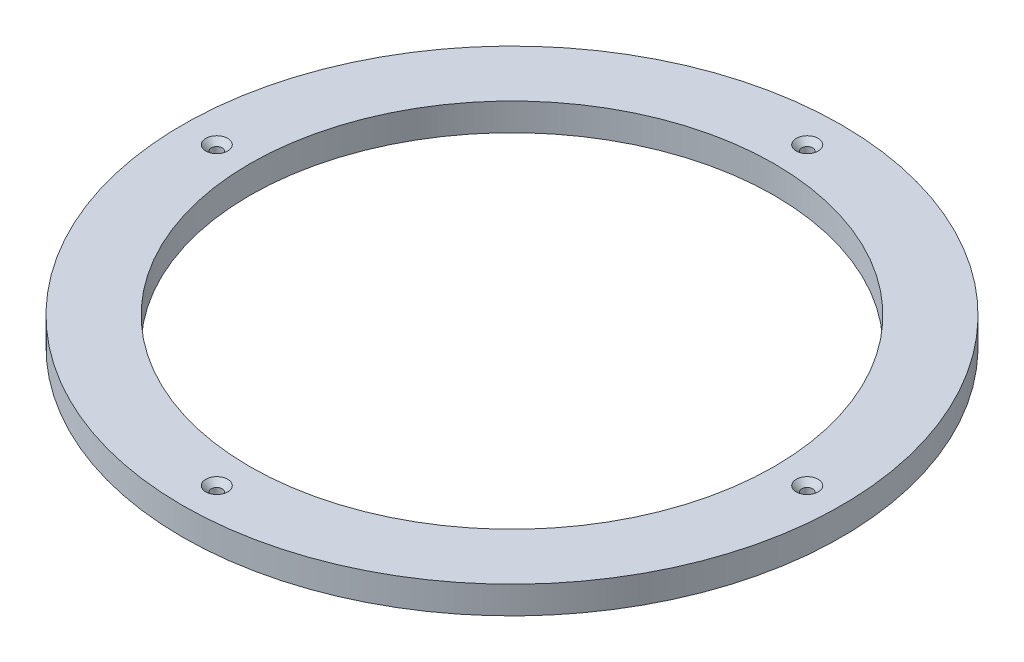
ISO-10303-21;
HEADER;
FILE_DESCRIPTION(('STEP AP214'),'2;1');
FILE_NAME('part.step','',(''),(''),'','','');
FILE_SCHEMA(('AUTOMOTIVE_DESIGN { 1 0 10303 214 1 1 1 1 }'));
ENDSEC;
DATA;
#1=APPLICATION_CONTEXT('core data for automotive mechanical design processes');
#2=APPLICATION_PROTOCOL_DEFINITION('international standard','automotive_design',2000,#1);
#3=PRODUCT_CONTEXT('',#1,'mechanical');
#4=PRODUCT('Part','Part','',(#3));
#5=PRODUCT_RELATED_PRODUCT_CATEGORY('part','',(#4));
#6=PRODUCT_DEFINITION_FORMATION('','',#4);
#7=PRODUCT_DEFINITION_CONTEXT('part definition',#1,'design');
#8=PRODUCT_DEFINITION('design','',#6,#7);
#9=PRODUCT_DEFINITION_SHAPE('','',#8);
#10=(LENGTH_UNIT() NAMED_UNIT(*) SI_UNIT(.MILLI.,.METRE.));
#11=(NAMED_UNIT(*) PLANE_ANGLE_UNIT() SI_UNIT($,.RADIAN.));
#12=(NAMED_UNIT(*) SI_UNIT($,.STERADIAN.) SOLID_ANGLE_UNIT());
#13=UNCERTAINTY_MEASURE_WITH_UNIT(LENGTH_MEASURE(1.E-05),#10,'distance_accuracy_value','');
#14=(GEOMETRIC_REPRESENTATION_CONTEXT(3) GLOBAL_UNCERTAINTY_ASSIGNED_CONTEXT((#13)) GLOBAL_UNIT_ASSIGNED_CONTEXT((#10,
#11,#12)) REPRESENTATION_CONTEXT('',''));
#15=CARTESIAN_POINT('',(0.,0.,0.));
#16=DIRECTION('',(0.,0.,1.));
#17=DIRECTION('',(1.,0.,0.));
#18=AXIS2_PLACEMENT_3D('',#15,#16,#17);
#19=CARTESIAN_POINT('',(0.,5.,0.));
#20=DIRECTION('',(0.,-1.,0.));
#21=DIRECTION('',(0.,0.,-1.));
#22=AXIS2_PLACEMENT_3D('',#19,#20,#21);
#23=CYLINDRICAL_SURFACE('',#22,60.);
#24=CARTESIAN_POINT('',(0.,5.,0.));
#25=DIRECTION('',(0.,1.,0.));
#26=DIRECTION('',(0.,0.,1.));
#27=AXIS2_PLACEMENT_3D('',#24,#25,#26);
#28=CIRCLE('',#27,60.);
#29=CARTESIAN_POINT('',(0.,5.,60.));
#30=VERTEX_POINT('',#29);
#31=EDGE_CURVE('E79',#30,#30,#28,.T.);
#32=ORIENTED_EDGE('',*,*,#31,.F.);
#33=EDGE_LOOP('',(#32));
#34=FACE_BOUND('',#33,.T.);
#35=CARTESIAN_POINT('',(0.,0.,0.));
#36=DIRECTION('',(0.,1.,0.));
#37=DIRECTION('',(0.,0.,1.));
#38=AXIS2_PLACEMENT_3D('',#35,#36,#37);
#39=CIRCLE('',#38,60.);
#40=CARTESIAN_POINT('',(0.,0.,60.));
#41=VERTEX_POINT('',#40);
#42=EDGE_CURVE('E80',#41,#41,#39,.T.);
#43=ORIENTED_EDGE('',*,*,#42,.T.);
#44=EDGE_LOOP('',(#43));
#45=FACE_BOUND('',#44,.T.);
#46=ADVANCED_FACE('F38',(#34,#45),#23,.T.);
#47=CARTESIAN_POINT('',(0.,5.,0.));
#48=DIRECTION('',(0.,1.,0.));
#49=DIRECTION('',(0.,0.,1.));
#50=AXIS2_PLACEMENT_3D('',#47,#48,#49);
#51=PLANE('',#50);
#52=CARTESIAN_POINT('',(0.,5.,0.));
#53=DIRECTION('',(0.,1.,0.));
#54=DIRECTION('',(0.,0.,1.));
#55=AXIS2_PLACEMENT_3D('',#52,#53,#54);
#56=CIRCLE('',#55,47.75);
#57=CARTESIAN_POINT('',(0.,5.,47.75));
#58=VERTEX_POINT('',#57);
#59=EDGE_CURVE('E107',#58,#58,#56,.T.);
#60=ORIENTED_EDGE('',*,*,#59,.F.);
#61=EDGE_LOOP('',(#60));
#62=FACE_BOUND('',#61,.T.);
#63=CARTESIAN_POINT('',(53.75,5.,-5.63001365888455E-13));
#64=DIRECTION('',(0.,1.,0.));
#65=DIRECTION('',(0.,0.,1.));
#66=AXIS2_PLACEMENT_3D('',#63,#64,#65);
#67=CIRCLE('',#66,2.00000000000004);
#68=CARTESIAN_POINT('',(53.75,5.,1.99999999999948));
#69=VERTEX_POINT('',#68);
#70=EDGE_CURVE('E10',#69,#69,#67,.F.);
#71=ORIENTED_EDGE('',*,*,#70,.T.);
#72=EDGE_LOOP('',(#71));
#73=FACE_BOUND('',#72,.T.);
#74=CARTESIAN_POINT('',(0.,5.,53.75));
#75=DIRECTION('',(0.,1.,0.));
#76=DIRECTION('',(0.,0.,1.));
#77=AXIS2_PLACEMENT_3D('',#74,#75,#76);
#78=CIRCLE('',#77,2.00000000000004);
#79=CARTESIAN_POINT('',(0.,5.,55.75));
#80=VERTEX_POINT('',#79);
#81=EDGE_CURVE('E52',#80,#80,#78,.F.);
#82=ORIENTED_EDGE('',*,*,#81,.T.);
#83=EDGE_LOOP('',(#82));
#84=FACE_BOUND('',#83,.T.);
#85=CARTESIAN_POINT('',(-53.75,5.,1.87667121962818E-13));
#86=DIRECTION('',(0.,1.,0.));
#87=DIRECTION('',(0.,0.,1.));
#88=AXIS2_PLACEMENT_3D('',#85,#86,#87);
#89=CIRCLE('',#88,2.00000000000004);
#90=CARTESIAN_POINT('',(-53.75,5.,2.00000000000023));
#91=VERTEX_POINT('',#90);
#92=EDGE_CURVE('E63',#91,#91,#89,.F.);
#93=ORIENTED_EDGE('',*,*,#92,.T.);
#94=EDGE_LOOP('',(#93));
#95=FACE_BOUND('',#94,.T.);
#96=CARTESIAN_POINT('',(0.,5.,-53.75));
#97=DIRECTION('',(0.,1.,0.));
#98=DIRECTION('',(0.,0.,1.));
#99=AXIS2_PLACEMENT_3D('',#96,#97,#98);
#100=CIRCLE('',#99,2.00000000000004);
#101=CARTESIAN_POINT('',(0.,5.,-51.75));
#102=VERTEX_POINT('',#101);
#103=EDGE_CURVE('E71',#102,#102,#100,.F.);
#104=ORIENTED_EDGE('',*,*,#103,.T.);
#105=EDGE_LOOP('',(#104));
#106=FACE_BOUND('',#105,.T.);
#107=ORIENTED_EDGE('',*,*,#31,.T.);
#108=EDGE_LOOP('',(#107));
#109=FACE_BOUND('',#108,.T.);
#110=ADVANCED_FACE('F114',(#62,#73,#84,#95,#106,#109),#51,.T.);
#111=CARTESIAN_POINT('',(0.,0.,0.));
#112=DIRECTION('',(0.,1.,0.));
#113=DIRECTION('',(0.,0.,1.));
#114=AXIS2_PLACEMENT_3D('',#111,#112,#113);
#115=PLANE('',#114);
#116=CARTESIAN_POINT('',(0.,0.,0.));
#117=DIRECTION('',(0.,1.,0.));
#118=DIRECTION('',(0.,0.,1.));
#119=AXIS2_PLACEMENT_3D('',#116,#117,#118);
#120=CIRCLE('',#119,47.75);
#121=CARTESIAN_POINT('',(0.,0.,47.75));
#122=VERTEX_POINT('',#121);
#123=EDGE_CURVE('E97',#122,#122,#120,.F.);
#124=ORIENTED_EDGE('',*,*,#123,.F.);
#125=EDGE_LOOP('',(#124));
#126=FACE_BOUND('',#125,.T.);
#127=CARTESIAN_POINT('',(-53.75,0.,1.87667121962818E-13));
#128=DIRECTION('',(0.,1.,0.));
#129=DIRECTION('',(0.,0.,1.));
#130=AXIS2_PLACEMENT_3D('',#127,#128,#129);
#131=CIRCLE('',#130,1.);
#132=CARTESIAN_POINT('',(-53.75,0.,1.00000000000019));
#133=VERTEX_POINT('',#132);
#134=EDGE_CURVE('E91',#133,#133,#131,.F.);
#135=ORIENTED_EDGE('',*,*,#134,.F.);
#136=EDGE_LOOP('',(#135));
#137=FACE_BOUND('',#136,.T.);
#138=CARTESIAN_POINT('',(0.,0.,53.75));
#139=DIRECTION('',(0.,1.,0.));
#140=DIRECTION('',(0.,0.,1.));
#141=AXIS2_PLACEMENT_3D('',#138,#139,#140);
#142=CIRCLE('',#141,1.);
#143=CARTESIAN_POINT('',(0.,0.,54.75));
#144=VERTEX_POINT('',#143);
#145=EDGE_CURVE('E96',#144,#144,#142,.F.);
#146=ORIENTED_EDGE('',*,*,#145,.F.);
#147=EDGE_LOOP('',(#146));
#148=FACE_BOUND('',#147,.T.);
#149=CARTESIAN_POINT('',(53.75,0.,-5.63001365888455E-13));
#150=DIRECTION('',(0.,1.,0.));
#151=DIRECTION('',(0.,0.,1.));
#152=AXIS2_PLACEMENT_3D('',#149,#150,#151);
#153=CIRCLE('',#152,1.);
#154=CARTESIAN_POINT('',(53.75,0.,0.999999999999437));
#155=VERTEX_POINT('',#154);
#156=EDGE_CURVE('E92',#155,#155,#153,.F.);
#157=ORIENTED_EDGE('',*,*,#156,.F.);
#158=EDGE_LOOP('',(#157));
#159=FACE_BOUND('',#158,.T.);
#160=CARTESIAN_POINT('',(0.,0.,-53.75));
#161=DIRECTION('',(0.,1.,0.));
#162=DIRECTION('',(0.,0.,1.));
#163=AXIS2_PLACEMENT_3D('',#160,#161,#162);
#164=CIRCLE('',#163,1.);
#165=CARTESIAN_POINT('',(0.,0.,-52.75));
#166=VERTEX_POINT('',#165);
#167=EDGE_CURVE('E84',#166,#166,#164,.F.);
#168=ORIENTED_EDGE('',*,*,#167,.F.);
#169=EDGE_LOOP('',(#168));
#170=FACE_BOUND('',#169,.T.);
#171=ORIENTED_EDGE('',*,*,#42,.F.);
#172=EDGE_LOOP('',(#171));
#173=FACE_BOUND('',#172,.T.);
#174=ADVANCED_FACE('F116',(#126,#137,#148,#159,#170,#173),#115,.F.);
#175=CARTESIAN_POINT('',(0.,-2.82842712474619,-53.75));
#176=DIRECTION('',(0.,1.,0.));
#177=DIRECTION('',(0.,0.,1.));
#178=AXIS2_PLACEMENT_3D('',#175,#176,#177);
#179=CYLINDRICAL_SURFACE('',#178,1.);
#180=CARTESIAN_POINT('',(0.,3.99999999999995,-53.75));
#181=DIRECTION('',(0.,1.,0.));
#182=DIRECTION('',(0.,0.,1.));
#183=AXIS2_PLACEMENT_3D('',#180,#181,#182);
#184=CIRCLE('',#183,1.);
#185=CARTESIAN_POINT('',(0.,3.99999999999995,-52.75));
#186=VERTEX_POINT('',#185);
#187=EDGE_CURVE('E75',#186,#186,#184,.T.);
#188=ORIENTED_EDGE('',*,*,#187,.T.);
#189=EDGE_LOOP('',(#188));
#190=FACE_BOUND('',#189,.T.);
#191=ORIENTED_EDGE('',*,*,#167,.T.);
#192=EDGE_LOOP('',(#191));
#193=FACE_BOUND('',#192,.T.);
#194=ADVANCED_FACE('F133',(#190,#193),#179,.F.);
#195=CARTESIAN_POINT('',(0.,3.99999999999995,-53.75));
#196=DIRECTION('',(0.,1.,0.));
#197=DIRECTION('',(0.,0.,1.));
#198=AXIS2_PLACEMENT_3D('',#195,#196,#197);
#199=CONICAL_SURFACE('',#198,1.,0.785398163397447);
#200=ORIENTED_EDGE('',*,*,#103,.F.);
#201=EDGE_LOOP('',(#200));
#202=FACE_BOUND('',#201,.T.);
#203=ORIENTED_EDGE('',*,*,#187,.F.);
#204=EDGE_LOOP('',(#203));
#205=FACE_BOUND('',#204,.T.);
#206=ADVANCED_FACE('F140',(#202,#205),#199,.F.);
#207=CARTESIAN_POINT('',(53.75,-2.82842712474619,-5.63001365888455E-13));
#208=DIRECTION('',(0.,1.,0.));
#209=DIRECTION('',(0.,0.,1.));
#210=AXIS2_PLACEMENT_3D('',#207,#208,#209);
#211=CYLINDRICAL_SURFACE('',#210,1.);
#212=CARTESIAN_POINT('',(53.75,3.99999999999995,-5.63001365888455E-13));
#213=DIRECTION('',(0.,1.,0.));
#214=DIRECTION('',(0.,0.,1.));
#215=AXIS2_PLACEMENT_3D('',#212,#213,#214);
#216=CIRCLE('',#215,1.);
#217=CARTESIAN_POINT('',(53.75,3.99999999999995,0.999999999999437));
#218=VERTEX_POINT('',#217);
#219=EDGE_CURVE('E47',#218,#218,#216,.T.);
#220=ORIENTED_EDGE('',*,*,#219,.T.);
#221=EDGE_LOOP('',(#220));
#222=FACE_BOUND('',#221,.T.);
#223=ORIENTED_EDGE('',*,*,#156,.T.);
#224=EDGE_LOOP('',(#223));
#225=FACE_BOUND('',#224,.T.);
#226=ADVANCED_FACE('F152',(#222,#225),#211,.F.);
#227=CARTESIAN_POINT('',(0.,-2.82842712474619,53.75));
#228=DIRECTION('',(0.,1.,0.));
#229=DIRECTION('',(0.,0.,1.));
#230=AXIS2_PLACEMENT_3D('',#227,#228,#229);
#231=CYLINDRICAL_SURFACE('',#230,1.);
#232=CARTESIAN_POINT('',(0.,3.99999999999995,53.75));
#233=DIRECTION('',(0.,1.,0.));
#234=DIRECTION('',(0.,0.,1.));
#235=AXIS2_PLACEMENT_3D('',#232,#233,#234);
#236=CIRCLE('',#235,1.);
#237=CARTESIAN_POINT('',(0.,3.99999999999995,54.75));
#238=VERTEX_POINT('',#237);
#239=EDGE_CURVE('E57',#238,#238,#236,.T.);
#240=ORIENTED_EDGE('',*,*,#239,.T.);
#241=EDGE_LOOP('',(#240));
#242=FACE_BOUND('',#241,.T.);
#243=ORIENTED_EDGE('',*,*,#145,.T.);
#244=EDGE_LOOP('',(#243));
#245=FACE_BOUND('',#244,.T.);
#246=ADVANCED_FACE('F173',(#242,#245),#231,.F.);
#247=CARTESIAN_POINT('',(-53.75,-2.82842712474619,1.87667121962818E-13));
#248=DIRECTION('',(0.,1.,0.));
#249=DIRECTION('',(0.,0.,1.));
#250=AXIS2_PLACEMENT_3D('',#247,#248,#249);
#251=CYLINDRICAL_SURFACE('',#250,1.);
#252=CARTESIAN_POINT('',(-53.75,3.99999999999995,1.87667121962818E-13));
#253=DIRECTION('',(0.,1.,0.));
#254=DIRECTION('',(0.,0.,1.));
#255=AXIS2_PLACEMENT_3D('',#252,#253,#254);
#256=CIRCLE('',#255,1.);
#257=CARTESIAN_POINT('',(-53.75,3.99999999999995,1.00000000000019));
#258=VERTEX_POINT('',#257);
#259=EDGE_CURVE('E67',#258,#258,#256,.T.);
#260=ORIENTED_EDGE('',*,*,#259,.T.);
#261=EDGE_LOOP('',(#260));
#262=FACE_BOUND('',#261,.T.);
#263=ORIENTED_EDGE('',*,*,#134,.T.);
#264=EDGE_LOOP('',(#263));
#265=FACE_BOUND('',#264,.T.);
#266=ADVANCED_FACE('F160',(#262,#265),#251,.F.);
#267=CARTESIAN_POINT('',(-53.75,3.99999999999995,1.87667121962818E-13));
#268=DIRECTION('',(0.,1.,0.));
#269=DIRECTION('',(0.,0.,1.));
#270=AXIS2_PLACEMENT_3D('',#267,#268,#269);
#271=CONICAL_SURFACE('',#270,1.,0.785398163397447);
#272=ORIENTED_EDGE('',*,*,#92,.F.);
#273=EDGE_LOOP('',(#272));
#274=FACE_BOUND('',#273,.T.);
#275=ORIENTED_EDGE('',*,*,#259,.F.);
#276=EDGE_LOOP('',(#275));
#277=FACE_BOUND('',#276,.T.);
#278=ADVANCED_FACE('F154',(#274,#277),#271,.F.);
#279=CARTESIAN_POINT('',(0.,3.99999999999995,53.75));
#280=DIRECTION('',(0.,1.,0.));
#281=DIRECTION('',(0.,0.,1.));
#282=AXIS2_PLACEMENT_3D('',#279,#280,#281);
#283=CONICAL_SURFACE('',#282,1.,0.785398163397447);
#284=ORIENTED_EDGE('',*,*,#81,.F.);
#285=EDGE_LOOP('',(#284));
#286=FACE_BOUND('',#285,.T.);
#287=ORIENTED_EDGE('',*,*,#239,.F.);
#288=EDGE_LOOP('',(#287));
#289=FACE_BOUND('',#288,.T.);
#290=ADVANCED_FACE('F159',(#286,#289),#283,.F.);
#291=CARTESIAN_POINT('',(53.75,3.99999999999995,-5.63001365888455E-13));
#292=DIRECTION('',(0.,1.,0.));
#293=DIRECTION('',(0.,0.,1.));
#294=AXIS2_PLACEMENT_3D('',#291,#292,#293);
#295=CONICAL_SURFACE('',#294,1.,0.785398163397447);
#296=ORIENTED_EDGE('',*,*,#70,.F.);
#297=EDGE_LOOP('',(#296));
#298=FACE_BOUND('',#297,.T.);
#299=ORIENTED_EDGE('',*,*,#219,.F.);
#300=EDGE_LOOP('',(#299));
#301=FACE_BOUND('',#300,.T.);
#302=ADVANCED_FACE('F41',(#298,#301),#295,.F.);
#303=CARTESIAN_POINT('',(0.,-135.057395206631,0.));
#304=DIRECTION('',(0.,1.,0.));
#305=DIRECTION('',(0.,0.,1.));
#306=AXIS2_PLACEMENT_3D('',#303,#304,#305);
#307=CYLINDRICAL_SURFACE('',#306,47.75);
#308=ORIENTED_EDGE('',*,*,#123,.T.);
#309=EDGE_LOOP('',(#308));
#310=FACE_BOUND('',#309,.T.);
#311=ORIENTED_EDGE('',*,*,#59,.T.);
#312=EDGE_LOOP('',(#311));
#313=FACE_BOUND('',#312,.T.);
#314=ADVANCED_FACE('F112',(#310,#313),#307,.F.);
#315=CLOSED_SHELL('',(#46,#110,#174,#194,#206,#226,#246,#266,#278,#290,#302,#314));
#316=MANIFOLD_SOLID_BREP('B2',#315);
#317=ADVANCED_BREP_SHAPE_REPRESENTATION('',(#18,#316),#14);
#318=SHAPE_DEFINITION_REPRESENTATION(#9,#317);
ENDSEC;
END-ISO-10303-21;
